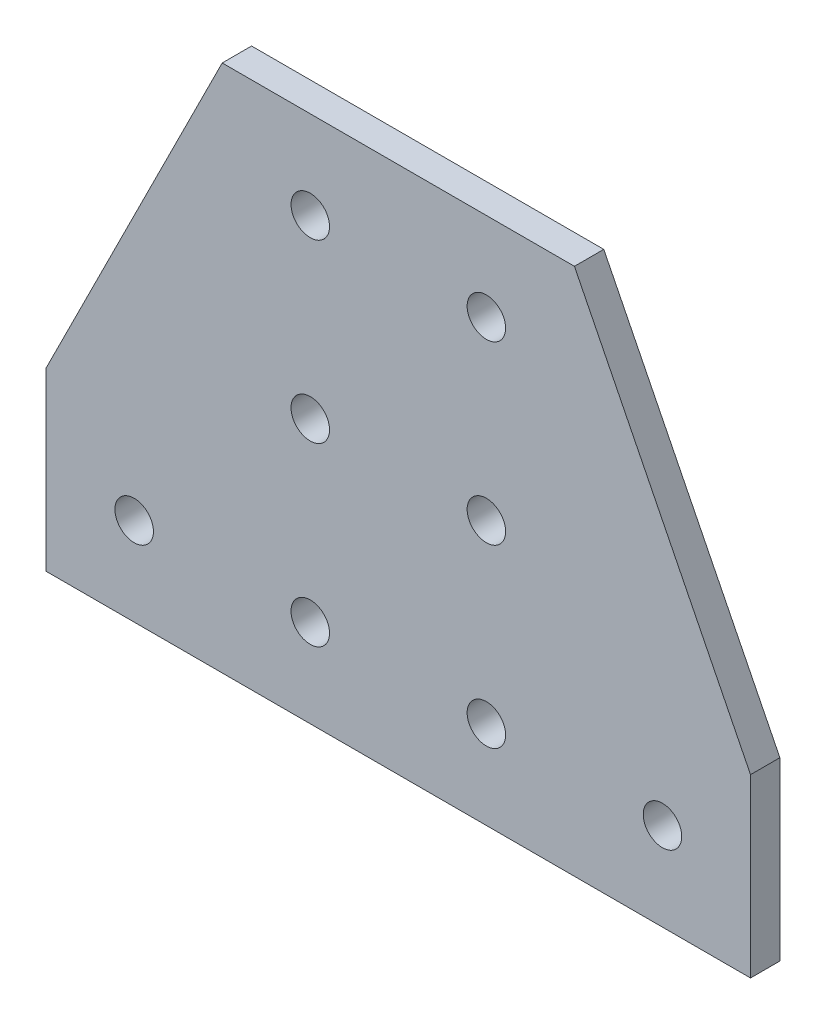
ISO-10303-21;
HEADER;
FILE_DESCRIPTION(('STEP AP214'),'2;1');
FILE_NAME('part.step','',(''),(''),'','','');
FILE_SCHEMA(('AUTOMOTIVE_DESIGN { 1 0 10303 214 1 1 1 1 }'));
ENDSEC;
DATA;
#1=APPLICATION_CONTEXT('core data for automotive mechanical design processes');
#2=APPLICATION_PROTOCOL_DEFINITION('international standard','automotive_design',2000,#1);
#3=PRODUCT_CONTEXT('',#1,'mechanical');
#4=PRODUCT('Part','Part','',(#3));
#5=PRODUCT_RELATED_PRODUCT_CATEGORY('part','',(#4));
#6=PRODUCT_DEFINITION_FORMATION('','',#4);
#7=PRODUCT_DEFINITION_CONTEXT('part definition',#1,'design');
#8=PRODUCT_DEFINITION('design','',#6,#7);
#9=PRODUCT_DEFINITION_SHAPE('','',#8);
#10=(LENGTH_UNIT() NAMED_UNIT(*) SI_UNIT(.MILLI.,.METRE.));
#11=(NAMED_UNIT(*) PLANE_ANGLE_UNIT() SI_UNIT($,.RADIAN.));
#12=(NAMED_UNIT(*) SI_UNIT($,.STERADIAN.) SOLID_ANGLE_UNIT());
#13=UNCERTAINTY_MEASURE_WITH_UNIT(LENGTH_MEASURE(1.E-05),#10,'distance_accuracy_value','');
#14=(GEOMETRIC_REPRESENTATION_CONTEXT(3) GLOBAL_UNCERTAINTY_ASSIGNED_CONTEXT((#13)) GLOBAL_UNIT_ASSIGNED_CONTEXT((#10,
#11,#12)) REPRESENTATION_CONTEXT('',''));
#15=CARTESIAN_POINT('',(0.,0.,0.));
#16=DIRECTION('',(0.,0.,1.));
#17=DIRECTION('',(1.,0.,0.));
#18=AXIS2_PLACEMENT_3D('',#15,#16,#17);
#19=CARTESIAN_POINT('',(0.,38.1,6.35));
#20=DIRECTION('',(1.,0.,0.));
#21=DIRECTION('',(0.,1.,0.));
#22=AXIS2_PLACEMENT_3D('',#19,#20,#21);
#23=PLANE('',#22);
#24=DIRECTION('',(0.,-1.,0.));
#25=VECTOR('',#24,1.);
#26=CARTESIAN_POINT('',(0.,38.1,0.));
#27=LINE('',#26,#25);
#28=CARTESIAN_POINT('',(0.,38.1,0.));
#29=VERTEX_POINT('',#28);
#30=CARTESIAN_POINT('',(0.,0.,0.));
#31=VERTEX_POINT('',#30);
#32=EDGE_CURVE('E89',#29,#31,#27,.T.);
#33=ORIENTED_EDGE('',*,*,#32,.T.);
#34=DIRECTION('',(0.,0.,-1.));
#35=VECTOR('',#34,1.);
#36=CARTESIAN_POINT('',(0.,0.,6.35));
#37=LINE('',#36,#35);
#38=CARTESIAN_POINT('',(0.,0.,6.35));
#39=VERTEX_POINT('',#38);
#40=EDGE_CURVE('E97',#39,#31,#37,.T.);
#41=ORIENTED_EDGE('',*,*,#40,.F.);
#42=DIRECTION('',(0.,-1.,0.));
#43=VECTOR('',#42,1.);
#44=CARTESIAN_POINT('',(0.,38.1,6.35));
#45=LINE('',#44,#43);
#46=CARTESIAN_POINT('',(0.,38.1,6.35));
#47=VERTEX_POINT('',#46);
#48=EDGE_CURVE('E121',#47,#39,#45,.T.);
#49=ORIENTED_EDGE('',*,*,#48,.F.);
#50=DIRECTION('',(0.,0.,-1.));
#51=VECTOR('',#50,1.);
#52=CARTESIAN_POINT('',(0.,38.1,6.35));
#53=LINE('',#52,#51);
#54=EDGE_CURVE('E106',#47,#29,#53,.T.);
#55=ORIENTED_EDGE('',*,*,#54,.T.);
#56=EDGE_LOOP('',(#33,#41,#49,#55));
#57=FACE_BOUND('',#56,.T.);
#58=ADVANCED_FACE('F30',(#57),#23,.F.);
#59=CARTESIAN_POINT('',(0.,0.,6.35));
#60=DIRECTION('',(0.,1.,0.));
#61=DIRECTION('',(-1.,0.,0.));
#62=AXIS2_PLACEMENT_3D('',#59,#60,#61);
#63=PLANE('',#62);
#64=DIRECTION('',(1.,0.,0.));
#65=VECTOR('',#64,1.);
#66=CARTESIAN_POINT('',(0.,0.,0.));
#67=LINE('',#66,#65);
#68=CARTESIAN_POINT('',(152.4,0.,0.));
#69=VERTEX_POINT('',#68);
#70=EDGE_CURVE('E83',#31,#69,#67,.T.);
#71=ORIENTED_EDGE('',*,*,#70,.T.);
#72=DIRECTION('',(0.,0.,-1.));
#73=VECTOR('',#72,1.);
#74=CARTESIAN_POINT('',(152.4,0.,6.35));
#75=LINE('',#74,#73);
#76=CARTESIAN_POINT('',(152.4,0.,6.35));
#77=VERTEX_POINT('',#76);
#78=EDGE_CURVE('E103',#77,#69,#75,.T.);
#79=ORIENTED_EDGE('',*,*,#78,.F.);
#80=DIRECTION('',(1.,0.,0.));
#81=VECTOR('',#80,1.);
#82=CARTESIAN_POINT('',(0.,0.,6.35));
#83=LINE('',#82,#81);
#84=EDGE_CURVE('E99',#39,#77,#83,.T.);
#85=ORIENTED_EDGE('',*,*,#84,.F.);
#86=ORIENTED_EDGE('',*,*,#40,.T.);
#87=EDGE_LOOP('',(#71,#79,#85,#86));
#88=FACE_BOUND('',#87,.T.);
#89=ADVANCED_FACE('F98',(#88),#63,.F.);
#90=CARTESIAN_POINT('',(152.4,0.,6.35));
#91=DIRECTION('',(-1.,0.,0.));
#92=DIRECTION('',(0.,-1.,0.));
#93=AXIS2_PLACEMENT_3D('',#90,#91,#92);
#94=PLANE('',#93);
#95=DIRECTION('',(0.,1.,0.));
#96=VECTOR('',#95,1.);
#97=CARTESIAN_POINT('',(152.4,0.,0.));
#98=LINE('',#97,#96);
#99=CARTESIAN_POINT('',(152.4,38.1,0.));
#100=VERTEX_POINT('',#99);
#101=EDGE_CURVE('E91',#69,#100,#98,.T.);
#102=ORIENTED_EDGE('',*,*,#101,.T.);
#103=DIRECTION('',(0.,0.,-1.));
#104=VECTOR('',#103,1.);
#105=CARTESIAN_POINT('',(152.4,38.1,6.35));
#106=LINE('',#105,#104);
#107=CARTESIAN_POINT('',(152.4,38.1,6.35));
#108=VERTEX_POINT('',#107);
#109=EDGE_CURVE('E137',#108,#100,#106,.T.);
#110=ORIENTED_EDGE('',*,*,#109,.F.);
#111=DIRECTION('',(0.,1.,0.));
#112=VECTOR('',#111,1.);
#113=CARTESIAN_POINT('',(152.4,0.,6.35));
#114=LINE('',#113,#112);
#115=EDGE_CURVE('E124',#77,#108,#114,.T.);
#116=ORIENTED_EDGE('',*,*,#115,.F.);
#117=ORIENTED_EDGE('',*,*,#78,.T.);
#118=EDGE_LOOP('',(#102,#110,#116,#117));
#119=FACE_BOUND('',#118,.T.);
#120=ADVANCED_FACE('F188',(#119),#94,.F.);
#121=CARTESIAN_POINT('',(152.4,38.1,6.35));
#122=DIRECTION('',(-0.894427190999916,-0.447213595499958,0.));
#123=DIRECTION('',(0.447213595499958,-0.894427190999916,0.));
#124=AXIS2_PLACEMENT_3D('',#121,#122,#123);
#125=PLANE('',#124);
#126=DIRECTION('',(-0.447213595499958,0.894427190999916,0.));
#127=VECTOR('',#126,1.);
#128=CARTESIAN_POINT('',(152.4,38.1,0.));
#129=LINE('',#128,#127);
#130=CARTESIAN_POINT('',(114.3,114.3,0.));
#131=VERTEX_POINT('',#130);
#132=EDGE_CURVE('E115',#100,#131,#129,.T.);
#133=ORIENTED_EDGE('',*,*,#132,.T.);
#134=DIRECTION('',(0.,0.,-1.));
#135=VECTOR('',#134,1.);
#136=CARTESIAN_POINT('',(114.3,114.3,6.35));
#137=LINE('',#136,#135);
#138=CARTESIAN_POINT('',(114.3,114.3,6.35));
#139=VERTEX_POINT('',#138);
#140=EDGE_CURVE('E134',#139,#131,#137,.T.);
#141=ORIENTED_EDGE('',*,*,#140,.F.);
#142=DIRECTION('',(-0.447213595499958,0.894427190999916,0.));
#143=VECTOR('',#142,1.);
#144=CARTESIAN_POINT('',(152.4,38.1,6.35));
#145=LINE('',#144,#143);
#146=EDGE_CURVE('E126',#108,#139,#145,.T.);
#147=ORIENTED_EDGE('',*,*,#146,.F.);
#148=ORIENTED_EDGE('',*,*,#109,.T.);
#149=EDGE_LOOP('',(#133,#141,#147,#148));
#150=FACE_BOUND('',#149,.T.);
#151=ADVANCED_FACE('F272',(#150),#125,.F.);
#152=CARTESIAN_POINT('',(114.3,114.3,6.35));
#153=DIRECTION('',(0.,-1.,0.));
#154=DIRECTION('',(1.,0.,0.));
#155=AXIS2_PLACEMENT_3D('',#152,#153,#154);
#156=PLANE('',#155);
#157=DIRECTION('',(-1.,0.,0.));
#158=VECTOR('',#157,1.);
#159=CARTESIAN_POINT('',(114.3,114.3,0.));
#160=LINE('',#159,#158);
#161=CARTESIAN_POINT('',(38.1,114.3,0.));
#162=VERTEX_POINT('',#161);
#163=EDGE_CURVE('E117',#131,#162,#160,.T.);
#164=ORIENTED_EDGE('',*,*,#163,.T.);
#165=DIRECTION('',(0.,0.,-1.));
#166=VECTOR('',#165,1.);
#167=CARTESIAN_POINT('',(38.1,114.3,6.35));
#168=LINE('',#167,#166);
#169=CARTESIAN_POINT('',(38.1,114.3,6.35));
#170=VERTEX_POINT('',#169);
#171=EDGE_CURVE('E131',#170,#162,#168,.T.);
#172=ORIENTED_EDGE('',*,*,#171,.F.);
#173=DIRECTION('',(-1.,0.,0.));
#174=VECTOR('',#173,1.);
#175=CARTESIAN_POINT('',(114.3,114.3,6.35));
#176=LINE('',#175,#174);
#177=EDGE_CURVE('E50',#139,#170,#176,.T.);
#178=ORIENTED_EDGE('',*,*,#177,.F.);
#179=ORIENTED_EDGE('',*,*,#140,.T.);
#180=EDGE_LOOP('',(#164,#172,#178,#179));
#181=FACE_BOUND('',#180,.T.);
#182=ADVANCED_FACE('F178',(#181),#156,.F.);
#183=CARTESIAN_POINT('',(38.1,114.3,6.35));
#184=DIRECTION('',(0.894427190999916,-0.447213595499958,0.));
#185=DIRECTION('',(0.447213595499958,0.894427190999916,0.));
#186=AXIS2_PLACEMENT_3D('',#183,#184,#185);
#187=PLANE('',#186);
#188=DIRECTION('',(-0.447213595499958,-0.894427190999916,0.));
#189=VECTOR('',#188,1.);
#190=CARTESIAN_POINT('',(38.1,114.3,0.));
#191=LINE('',#190,#189);
#192=EDGE_CURVE('E119',#162,#29,#191,.T.);
#193=ORIENTED_EDGE('',*,*,#192,.T.);
#194=ORIENTED_EDGE('',*,*,#54,.F.);
#195=DIRECTION('',(-0.447213595499958,-0.894427190999916,0.));
#196=VECTOR('',#195,1.);
#197=CARTESIAN_POINT('',(38.1,114.3,6.35));
#198=LINE('',#197,#196);
#199=EDGE_CURVE('E45',#170,#47,#198,.T.);
#200=ORIENTED_EDGE('',*,*,#199,.F.);
#201=ORIENTED_EDGE('',*,*,#171,.T.);
#202=EDGE_LOOP('',(#193,#194,#200,#201));
#203=FACE_BOUND('',#202,.T.);
#204=ADVANCED_FACE('F168',(#203),#187,.F.);
#205=CARTESIAN_POINT('',(0.,114.3,6.35));
#206=DIRECTION('',(0.,0.,-1.));
#207=DIRECTION('',(-1.,0.,0.));
#208=AXIS2_PLACEMENT_3D('',#205,#206,#207);
#209=PLANE('',#208);
#210=CARTESIAN_POINT('',(95.25,57.15,6.35));
#211=DIRECTION('',(0.,0.,1.));
#212=DIRECTION('',(1.,0.,0.));
#213=AXIS2_PLACEMENT_3D('',#210,#211,#212);
#214=CIRCLE('',#213,4.1656);
#215=CARTESIAN_POINT('',(99.4156,57.15,6.35));
#216=VERTEX_POINT('',#215);
#217=EDGE_CURVE('E247',#216,#216,#214,.T.);
#218=ORIENTED_EDGE('',*,*,#217,.F.);
#219=EDGE_LOOP('',(#218));
#220=FACE_BOUND('',#219,.T.);
#221=CARTESIAN_POINT('',(57.15,57.15,6.35));
#222=DIRECTION('',(0.,0.,1.));
#223=DIRECTION('',(1.,0.,0.));
#224=AXIS2_PLACEMENT_3D('',#221,#222,#223);
#225=CIRCLE('',#224,4.1656);
#226=CARTESIAN_POINT('',(61.3156,57.15,6.35));
#227=VERTEX_POINT('',#226);
#228=EDGE_CURVE('E244',#227,#227,#225,.T.);
#229=ORIENTED_EDGE('',*,*,#228,.F.);
#230=EDGE_LOOP('',(#229));
#231=FACE_BOUND('',#230,.T.);
#232=CARTESIAN_POINT('',(57.15,19.05,6.35));
#233=DIRECTION('',(0.,0.,1.));
#234=DIRECTION('',(1.,0.,0.));
#235=AXIS2_PLACEMENT_3D('',#232,#233,#234);
#236=CIRCLE('',#235,4.1656);
#237=CARTESIAN_POINT('',(61.3156,19.05,6.35));
#238=VERTEX_POINT('',#237);
#239=EDGE_CURVE('E234',#238,#238,#236,.T.);
#240=ORIENTED_EDGE('',*,*,#239,.F.);
#241=EDGE_LOOP('',(#240));
#242=FACE_BOUND('',#241,.T.);
#243=CARTESIAN_POINT('',(19.05,19.05,6.35));
#244=DIRECTION('',(0.,0.,1.));
#245=DIRECTION('',(1.,0.,0.));
#246=AXIS2_PLACEMENT_3D('',#243,#244,#245);
#247=CIRCLE('',#246,4.1656);
#248=CARTESIAN_POINT('',(23.2156,19.05,6.35));
#249=VERTEX_POINT('',#248);
#250=EDGE_CURVE('E110',#249,#249,#247,.T.);
#251=ORIENTED_EDGE('',*,*,#250,.F.);
#252=EDGE_LOOP('',(#251));
#253=FACE_BOUND('',#252,.T.);
#254=ORIENTED_EDGE('',*,*,#48,.T.);
#255=ORIENTED_EDGE('',*,*,#84,.T.);
#256=ORIENTED_EDGE('',*,*,#115,.T.);
#257=ORIENTED_EDGE('',*,*,#146,.T.);
#258=ORIENTED_EDGE('',*,*,#177,.T.);
#259=ORIENTED_EDGE('',*,*,#199,.T.);
#260=EDGE_LOOP('',(#254,#255,#256,#257,#258,#259));
#261=FACE_BOUND('',#260,.T.);
#262=CARTESIAN_POINT('',(95.25,19.05,6.35));
#263=DIRECTION('',(0.,0.,1.));
#264=DIRECTION('',(1.,0.,0.));
#265=AXIS2_PLACEMENT_3D('',#262,#263,#264);
#266=CIRCLE('',#265,4.1656);
#267=CARTESIAN_POINT('',(99.4156,19.05,6.35));
#268=VERTEX_POINT('',#267);
#269=EDGE_CURVE('E143',#268,#268,#266,.T.);
#270=ORIENTED_EDGE('',*,*,#269,.F.);
#271=EDGE_LOOP('',(#270));
#272=FACE_BOUND('',#271,.T.);
#273=CARTESIAN_POINT('',(133.35,19.05,6.35));
#274=DIRECTION('',(0.,0.,1.));
#275=DIRECTION('',(1.,0.,0.));
#276=AXIS2_PLACEMENT_3D('',#273,#274,#275);
#277=CIRCLE('',#276,4.1656);
#278=CARTESIAN_POINT('',(137.5156,19.05,6.35));
#279=VERTEX_POINT('',#278);
#280=EDGE_CURVE('E149',#279,#279,#277,.T.);
#281=ORIENTED_EDGE('',*,*,#280,.F.);
#282=EDGE_LOOP('',(#281));
#283=FACE_BOUND('',#282,.T.);
#284=CARTESIAN_POINT('',(57.15,95.25,6.35));
#285=DIRECTION('',(0.,0.,1.));
#286=DIRECTION('',(1.,0.,0.));
#287=AXIS2_PLACEMENT_3D('',#284,#285,#286);
#288=CIRCLE('',#287,4.1656);
#289=CARTESIAN_POINT('',(61.3156,95.25,6.35));
#290=VERTEX_POINT('',#289);
#291=EDGE_CURVE('E155',#290,#290,#288,.T.);
#292=ORIENTED_EDGE('',*,*,#291,.F.);
#293=EDGE_LOOP('',(#292));
#294=FACE_BOUND('',#293,.T.);
#295=CARTESIAN_POINT('',(95.25,95.25,6.35));
#296=DIRECTION('',(0.,0.,1.));
#297=DIRECTION('',(1.,0.,0.));
#298=AXIS2_PLACEMENT_3D('',#295,#296,#297);
#299=CIRCLE('',#298,4.1656);
#300=CARTESIAN_POINT('',(99.4156,95.25,6.35));
#301=VERTEX_POINT('',#300);
#302=EDGE_CURVE('E11',#301,#301,#299,.T.);
#303=ORIENTED_EDGE('',*,*,#302,.F.);
#304=EDGE_LOOP('',(#303));
#305=FACE_BOUND('',#304,.T.);
#306=ADVANCED_FACE('F166',(#220,#231,#242,#253,#261,#272,#283,#294,#305),#209,.F.);
#307=CARTESIAN_POINT('',(0.,114.3,0.));
#308=DIRECTION('',(0.,0.,-1.));
#309=DIRECTION('',(-1.,0.,0.));
#310=AXIS2_PLACEMENT_3D('',#307,#308,#309);
#311=PLANE('',#310);
#312=CARTESIAN_POINT('',(95.25,57.15,0.));
#313=DIRECTION('',(0.,0.,1.));
#314=DIRECTION('',(1.,0.,0.));
#315=AXIS2_PLACEMENT_3D('',#312,#313,#314);
#316=CIRCLE('',#315,4.1656);
#317=CARTESIAN_POINT('',(99.4156,57.15,0.));
#318=VERTEX_POINT('',#317);
#319=EDGE_CURVE('E250',#318,#318,#316,.T.);
#320=ORIENTED_EDGE('',*,*,#319,.T.);
#321=EDGE_LOOP('',(#320));
#322=FACE_BOUND('',#321,.T.);
#323=CARTESIAN_POINT('',(57.15,57.15,0.));
#324=DIRECTION('',(0.,0.,1.));
#325=DIRECTION('',(1.,0.,0.));
#326=AXIS2_PLACEMENT_3D('',#323,#324,#325);
#327=CIRCLE('',#326,4.1656);
#328=CARTESIAN_POINT('',(61.3156,57.15,0.));
#329=VERTEX_POINT('',#328);
#330=EDGE_CURVE('E241',#329,#329,#327,.T.);
#331=ORIENTED_EDGE('',*,*,#330,.T.);
#332=EDGE_LOOP('',(#331));
#333=FACE_BOUND('',#332,.T.);
#334=CARTESIAN_POINT('',(57.15,19.05,0.));
#335=DIRECTION('',(0.,0.,1.));
#336=DIRECTION('',(1.,0.,0.));
#337=AXIS2_PLACEMENT_3D('',#334,#335,#336);
#338=CIRCLE('',#337,4.1656);
#339=CARTESIAN_POINT('',(61.3156,19.05,0.));
#340=VERTEX_POINT('',#339);
#341=EDGE_CURVE('E236',#340,#340,#338,.T.);
#342=ORIENTED_EDGE('',*,*,#341,.T.);
#343=EDGE_LOOP('',(#342));
#344=FACE_BOUND('',#343,.T.);
#345=CARTESIAN_POINT('',(19.05,19.05,0.));
#346=DIRECTION('',(0.,0.,1.));
#347=DIRECTION('',(1.,0.,0.));
#348=AXIS2_PLACEMENT_3D('',#345,#346,#347);
#349=CIRCLE('',#348,4.1656);
#350=CARTESIAN_POINT('',(23.2156,19.05,0.));
#351=VERTEX_POINT('',#350);
#352=EDGE_CURVE('E107',#351,#351,#349,.T.);
#353=ORIENTED_EDGE('',*,*,#352,.T.);
#354=EDGE_LOOP('',(#353));
#355=FACE_BOUND('',#354,.T.);
#356=ORIENTED_EDGE('',*,*,#32,.F.);
#357=ORIENTED_EDGE('',*,*,#192,.F.);
#358=ORIENTED_EDGE('',*,*,#163,.F.);
#359=ORIENTED_EDGE('',*,*,#132,.F.);
#360=ORIENTED_EDGE('',*,*,#101,.F.);
#361=ORIENTED_EDGE('',*,*,#70,.F.);
#362=EDGE_LOOP('',(#356,#357,#358,#359,#360,#361));
#363=FACE_BOUND('',#362,.T.);
#364=CARTESIAN_POINT('',(95.25,19.05,0.));
#365=DIRECTION('',(0.,0.,1.));
#366=DIRECTION('',(1.,0.,0.));
#367=AXIS2_PLACEMENT_3D('',#364,#365,#366);
#368=CIRCLE('',#367,4.1656);
#369=CARTESIAN_POINT('',(99.4156,19.05,0.));
#370=VERTEX_POINT('',#369);
#371=EDGE_CURVE('E102',#370,#370,#368,.T.);
#372=ORIENTED_EDGE('',*,*,#371,.T.);
#373=EDGE_LOOP('',(#372));
#374=FACE_BOUND('',#373,.T.);
#375=CARTESIAN_POINT('',(133.35,19.05,0.));
#376=DIRECTION('',(0.,0.,1.));
#377=DIRECTION('',(1.,0.,0.));
#378=AXIS2_PLACEMENT_3D('',#375,#376,#377);
#379=CIRCLE('',#378,4.1656);
#380=CARTESIAN_POINT('',(137.5156,19.05,0.));
#381=VERTEX_POINT('',#380);
#382=EDGE_CURVE('E146',#381,#381,#379,.T.);
#383=ORIENTED_EDGE('',*,*,#382,.T.);
#384=EDGE_LOOP('',(#383));
#385=FACE_BOUND('',#384,.T.);
#386=CARTESIAN_POINT('',(57.15,95.25,0.));
#387=DIRECTION('',(0.,0.,1.));
#388=DIRECTION('',(1.,0.,0.));
#389=AXIS2_PLACEMENT_3D('',#386,#387,#388);
#390=CIRCLE('',#389,4.1656);
#391=CARTESIAN_POINT('',(61.3156,95.25,0.));
#392=VERTEX_POINT('',#391);
#393=EDGE_CURVE('E152',#392,#392,#390,.T.);
#394=ORIENTED_EDGE('',*,*,#393,.T.);
#395=EDGE_LOOP('',(#394));
#396=FACE_BOUND('',#395,.T.);
#397=CARTESIAN_POINT('',(95.25,95.25,0.));
#398=DIRECTION('',(0.,0.,1.));
#399=DIRECTION('',(1.,0.,0.));
#400=AXIS2_PLACEMENT_3D('',#397,#398,#399);
#401=CIRCLE('',#400,4.1656);
#402=CARTESIAN_POINT('',(99.4156,95.25,0.));
#403=VERTEX_POINT('',#402);
#404=EDGE_CURVE('E38',#403,#403,#401,.T.);
#405=ORIENTED_EDGE('',*,*,#404,.T.);
#406=EDGE_LOOP('',(#405));
#407=FACE_BOUND('',#406,.T.);
#408=ADVANCED_FACE('F85',(#322,#333,#344,#355,#363,#374,#385,#396,#407),#311,.T.);
#409=CARTESIAN_POINT('',(19.05,19.05,0.));
#410=DIRECTION('',(0.,0.,1.));
#411=DIRECTION('',(1.,0.,0.));
#412=AXIS2_PLACEMENT_3D('',#409,#410,#411);
#413=CYLINDRICAL_SURFACE('',#412,4.1656);
#414=ORIENTED_EDGE('',*,*,#352,.F.);
#415=EDGE_LOOP('',(#414));
#416=FACE_BOUND('',#415,.T.);
#417=ORIENTED_EDGE('',*,*,#250,.T.);
#418=EDGE_LOOP('',(#417));
#419=FACE_BOUND('',#418,.T.);
#420=ADVANCED_FACE('F175',(#416,#419),#413,.F.);
#421=CARTESIAN_POINT('',(57.15,19.05,0.));
#422=DIRECTION('',(0.,0.,1.));
#423=DIRECTION('',(1.,0.,0.));
#424=AXIS2_PLACEMENT_3D('',#421,#422,#423);
#425=CYLINDRICAL_SURFACE('',#424,4.1656);
#426=ORIENTED_EDGE('',*,*,#341,.F.);
#427=EDGE_LOOP('',(#426));
#428=FACE_BOUND('',#427,.T.);
#429=ORIENTED_EDGE('',*,*,#239,.T.);
#430=EDGE_LOOP('',(#429));
#431=FACE_BOUND('',#430,.T.);
#432=ADVANCED_FACE('F196',(#428,#431),#425,.F.);
#433=CARTESIAN_POINT('',(95.25,19.05,0.));
#434=DIRECTION('',(0.,0.,1.));
#435=DIRECTION('',(1.,0.,0.));
#436=AXIS2_PLACEMENT_3D('',#433,#434,#435);
#437=CYLINDRICAL_SURFACE('',#436,4.1656);
#438=ORIENTED_EDGE('',*,*,#371,.F.);
#439=EDGE_LOOP('',(#438));
#440=FACE_BOUND('',#439,.T.);
#441=ORIENTED_EDGE('',*,*,#269,.T.);
#442=EDGE_LOOP('',(#441));
#443=FACE_BOUND('',#442,.T.);
#444=ADVANCED_FACE('F192',(#440,#443),#437,.F.);
#445=CARTESIAN_POINT('',(133.35,19.05,0.));
#446=DIRECTION('',(0.,0.,1.));
#447=DIRECTION('',(1.,0.,0.));
#448=AXIS2_PLACEMENT_3D('',#445,#446,#447);
#449=CYLINDRICAL_SURFACE('',#448,4.1656);
#450=ORIENTED_EDGE('',*,*,#382,.F.);
#451=EDGE_LOOP('',(#450));
#452=FACE_BOUND('',#451,.T.);
#453=ORIENTED_EDGE('',*,*,#280,.T.);
#454=EDGE_LOOP('',(#453));
#455=FACE_BOUND('',#454,.T.);
#456=ADVANCED_FACE('F195',(#452,#455),#449,.F.);
#457=CARTESIAN_POINT('',(57.15,57.15,0.));
#458=DIRECTION('',(0.,0.,1.));
#459=DIRECTION('',(1.,0.,0.));
#460=AXIS2_PLACEMENT_3D('',#457,#458,#459);
#461=CYLINDRICAL_SURFACE('',#460,4.1656);
#462=ORIENTED_EDGE('',*,*,#330,.F.);
#463=EDGE_LOOP('',(#462));
#464=FACE_BOUND('',#463,.T.);
#465=ORIENTED_EDGE('',*,*,#228,.T.);
#466=EDGE_LOOP('',(#465));
#467=FACE_BOUND('',#466,.T.);
#468=ADVANCED_FACE('F199',(#464,#467),#461,.F.);
#469=CARTESIAN_POINT('',(95.25,57.15,0.));
#470=DIRECTION('',(0.,0.,1.));
#471=DIRECTION('',(1.,0.,0.));
#472=AXIS2_PLACEMENT_3D('',#469,#470,#471);
#473=CYLINDRICAL_SURFACE('',#472,4.1656);
#474=ORIENTED_EDGE('',*,*,#319,.F.);
#475=EDGE_LOOP('',(#474));
#476=FACE_BOUND('',#475,.T.);
#477=ORIENTED_EDGE('',*,*,#217,.T.);
#478=EDGE_LOOP('',(#477));
#479=FACE_BOUND('',#478,.T.);
#480=ADVANCED_FACE('F202',(#476,#479),#473,.F.);
#481=CARTESIAN_POINT('',(57.15,95.25,0.));
#482=DIRECTION('',(0.,0.,1.));
#483=DIRECTION('',(1.,0.,0.));
#484=AXIS2_PLACEMENT_3D('',#481,#482,#483);
#485=CYLINDRICAL_SURFACE('',#484,4.1656);
#486=ORIENTED_EDGE('',*,*,#393,.F.);
#487=EDGE_LOOP('',(#486));
#488=FACE_BOUND('',#487,.T.);
#489=ORIENTED_EDGE('',*,*,#291,.T.);
#490=EDGE_LOOP('',(#489));
#491=FACE_BOUND('',#490,.T.);
#492=ADVANCED_FACE('F163',(#488,#491),#485,.F.);
#493=CARTESIAN_POINT('',(95.25,95.25,0.));
#494=DIRECTION('',(0.,0.,1.));
#495=DIRECTION('',(1.,0.,0.));
#496=AXIS2_PLACEMENT_3D('',#493,#494,#495);
#497=CYLINDRICAL_SURFACE('',#496,4.1656);
#498=ORIENTED_EDGE('',*,*,#404,.F.);
#499=EDGE_LOOP('',(#498));
#500=FACE_BOUND('',#499,.T.);
#501=ORIENTED_EDGE('',*,*,#302,.T.);
#502=EDGE_LOOP('',(#501));
#503=FACE_BOUND('',#502,.T.);
#504=ADVANCED_FACE('F32',(#500,#503),#497,.F.);
#505=CLOSED_SHELL('',(#58,#89,#120,#151,#182,#204,#306,#408,#420,#432,#444,#456,#468,#480,#492,#504));
#506=MANIFOLD_SOLID_BREP('B2',#505);
#507=ADVANCED_BREP_SHAPE_REPRESENTATION('',(#18,#506),#14);
#508=SHAPE_DEFINITION_REPRESENTATION(#9,#507);
ENDSEC;
END-ISO-10303-21;
